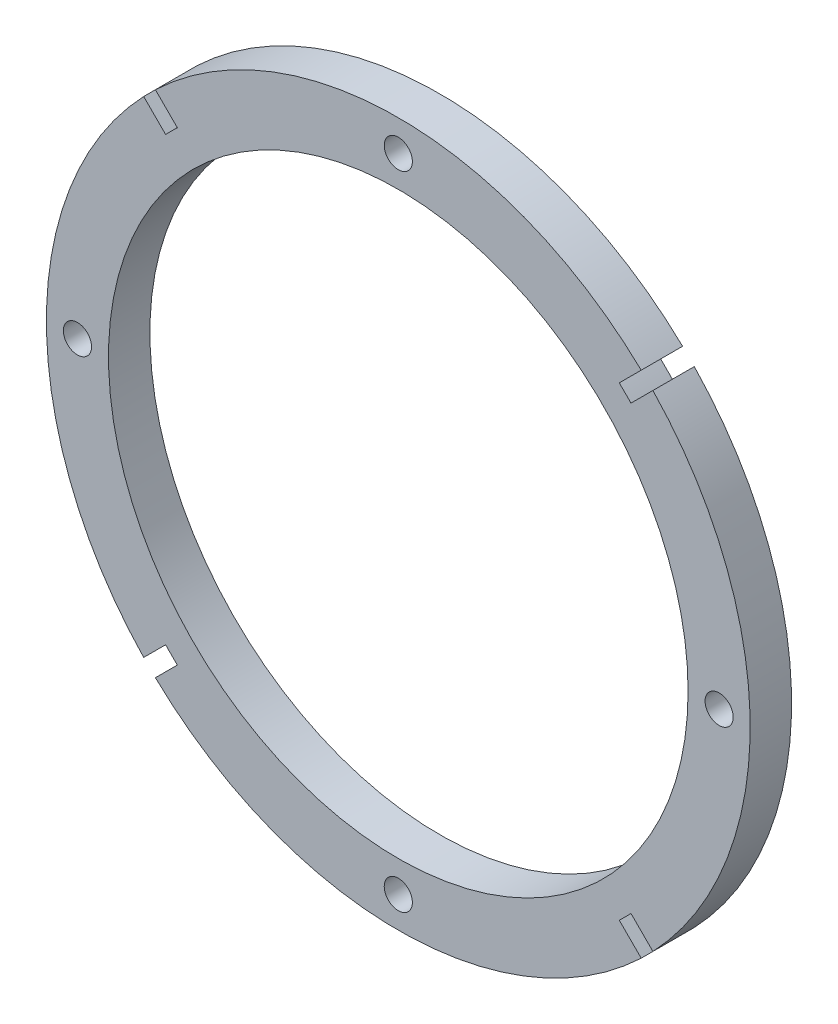
ISO-10303-21;
HEADER;
FILE_DESCRIPTION(('STEP AP214'),'2;1');
FILE_NAME('part.step','',(''),(''),'','','');
FILE_SCHEMA(('AUTOMOTIVE_DESIGN { 1 0 10303 214 1 1 1 1 }'));
ENDSEC;
DATA;
#1=APPLICATION_CONTEXT('core data for automotive mechanical design processes');
#2=APPLICATION_PROTOCOL_DEFINITION('international standard','automotive_design',2000,#1);
#3=PRODUCT_CONTEXT('',#1,'mechanical');
#4=PRODUCT('Part','Part','',(#3));
#5=PRODUCT_RELATED_PRODUCT_CATEGORY('part','',(#4));
#6=PRODUCT_DEFINITION_FORMATION('','',#4);
#7=PRODUCT_DEFINITION_CONTEXT('part definition',#1,'design');
#8=PRODUCT_DEFINITION('design','',#6,#7);
#9=PRODUCT_DEFINITION_SHAPE('','',#8);
#10=(LENGTH_UNIT() NAMED_UNIT(*) SI_UNIT(.MILLI.,.METRE.));
#11=(NAMED_UNIT(*) PLANE_ANGLE_UNIT() SI_UNIT($,.RADIAN.));
#12=(NAMED_UNIT(*) SI_UNIT($,.STERADIAN.) SOLID_ANGLE_UNIT());
#13=UNCERTAINTY_MEASURE_WITH_UNIT(LENGTH_MEASURE(1.E-05),#10,'distance_accuracy_value','');
#14=(GEOMETRIC_REPRESENTATION_CONTEXT(3) GLOBAL_UNCERTAINTY_ASSIGNED_CONTEXT((#13)) GLOBAL_UNIT_ASSIGNED_CONTEXT((#10,
#11,#12)) REPRESENTATION_CONTEXT('',''));
#15=CARTESIAN_POINT('',(0.,0.,0.));
#16=DIRECTION('',(0.,0.,1.));
#17=DIRECTION('',(1.,0.,0.));
#18=AXIS2_PLACEMENT_3D('',#15,#16,#17);
#19=CARTESIAN_POINT('',(0.,0.,10.));
#20=DIRECTION('',(0.,0.,-1.));
#21=DIRECTION('',(-1.,0.,0.));
#22=AXIS2_PLACEMENT_3D('',#19,#20,#21);
#23=CYLINDRICAL_SURFACE('',#22,85.);
#24=CARTESIAN_POINT('',(0.,0.,0.));
#25=DIRECTION('',(0.,0.,1.));
#26=DIRECTION('',(1.,0.,0.));
#27=AXIS2_PLACEMENT_3D('',#24,#25,#26);
#28=CIRCLE('',#27,85.);
#29=CARTESIAN_POINT('',(-61.5016498531649,58.6732227284193,0.));
#30=VERTEX_POINT('',#29);
#31=CARTESIAN_POINT('',(-61.5016498531653,-58.6732227284189,0.));
#32=VERTEX_POINT('',#31);
#33=EDGE_CURVE('E55',#30,#32,#28,.T.);
#34=ORIENTED_EDGE('',*,*,#33,.T.);
#35=DIRECTION('',(0.,0.,1.));
#36=VECTOR('',#35,1.);
#37=CARTESIAN_POINT('',(-61.5016498531653,-58.6732227284189,0.));
#38=LINE('',#37,#36);
#39=CARTESIAN_POINT('',(-61.5016498531653,-58.6732227284189,10.));
#40=VERTEX_POINT('',#39);
#41=EDGE_CURVE('E205',#32,#40,#38,.T.);
#42=ORIENTED_EDGE('',*,*,#41,.T.);
#43=CARTESIAN_POINT('',(0.,0.,10.));
#44=DIRECTION('',(0.,0.,1.));
#45=DIRECTION('',(1.,0.,0.));
#46=AXIS2_PLACEMENT_3D('',#43,#44,#45);
#47=CIRCLE('',#46,85.);
#48=CARTESIAN_POINT('',(-61.5016498531649,58.6732227284194,10.));
#49=VERTEX_POINT('',#48);
#50=EDGE_CURVE('E12',#49,#40,#47,.T.);
#51=ORIENTED_EDGE('',*,*,#50,.F.);
#52=DIRECTION('',(0.,0.,1.));
#53=VECTOR('',#52,1.);
#54=CARTESIAN_POINT('',(-61.5016498531649,58.6732227284194,0.));
#55=LINE('',#54,#53);
#56=EDGE_CURVE('E277',#30,#49,#55,.T.);
#57=ORIENTED_EDGE('',*,*,#56,.F.);
#58=EDGE_LOOP('',(#34,#42,#51,#57));
#59=FACE_BOUND('',#58,.T.);
#60=ADVANCED_FACE('F51',(#59),#23,.T.);
#61=CARTESIAN_POINT('',(-58.6732227284191,-61.5016498531651,10.));
#62=VERTEX_POINT('',#61);
#63=CARTESIAN_POINT('',(58.6732227284187,-61.5016498531655,10.));
#64=VERTEX_POINT('',#63);
#65=EDGE_CURVE('E60',#62,#64,#47,.T.);
#66=ORIENTED_EDGE('',*,*,#65,.F.);
#67=DIRECTION('',(0.,0.,1.));
#68=VECTOR('',#67,1.);
#69=CARTESIAN_POINT('',(-58.6732227284191,-61.5016498531651,0.));
#70=LINE('',#69,#68);
#71=CARTESIAN_POINT('',(-58.6732227284191,-61.5016498531651,0.));
#72=VERTEX_POINT('',#71);
#73=EDGE_CURVE('E177',#72,#62,#70,.T.);
#74=ORIENTED_EDGE('',*,*,#73,.F.);
#75=CARTESIAN_POINT('',(58.6732227284187,-61.5016498531655,0.));
#76=VERTEX_POINT('',#75);
#77=EDGE_CURVE('E192',#72,#76,#28,.T.);
#78=ORIENTED_EDGE('',*,*,#77,.T.);
#79=DIRECTION('',(0.,0.,1.));
#80=VECTOR('',#79,1.);
#81=CARTESIAN_POINT('',(58.6732227284187,-61.5016498531655,0.));
#82=LINE('',#81,#80);
#83=EDGE_CURVE('E215',#76,#64,#82,.T.);
#84=ORIENTED_EDGE('',*,*,#83,.T.);
#85=EDGE_LOOP('',(#66,#74,#78,#84));
#86=FACE_BOUND('',#85,.T.);
#87=ADVANCED_FACE('F331',(#86),#23,.T.);
#88=CARTESIAN_POINT('',(61.5016498531649,-58.6732227284194,10.));
#89=VERTEX_POINT('',#88);
#90=CARTESIAN_POINT('',(61.5016498531649,58.6732227284194,10.));
#91=VERTEX_POINT('',#90);
#92=EDGE_CURVE('E343',#89,#91,#47,.T.);
#93=ORIENTED_EDGE('',*,*,#92,.F.);
#94=DIRECTION('',(0.,0.,1.));
#95=VECTOR('',#94,1.);
#96=CARTESIAN_POINT('',(61.5016498531649,-58.6732227284194,0.));
#97=LINE('',#96,#95);
#98=CARTESIAN_POINT('',(61.5016498531649,-58.6732227284193,0.));
#99=VERTEX_POINT('',#98);
#100=EDGE_CURVE('E223',#99,#89,#97,.T.);
#101=ORIENTED_EDGE('',*,*,#100,.F.);
#102=CARTESIAN_POINT('',(61.5016498531649,58.6732227284194,0.));
#103=VERTEX_POINT('',#102);
#104=EDGE_CURVE('E345',#99,#103,#28,.T.);
#105=ORIENTED_EDGE('',*,*,#104,.T.);
#106=DIRECTION('',(0.,0.,1.));
#107=VECTOR('',#106,1.);
#108=CARTESIAN_POINT('',(61.5016498531649,58.6732227284194,0.));
#109=LINE('',#108,#107);
#110=EDGE_CURVE('E244',#103,#91,#109,.T.);
#111=ORIENTED_EDGE('',*,*,#110,.T.);
#112=EDGE_LOOP('',(#93,#101,#105,#111));
#113=FACE_BOUND('',#112,.T.);
#114=ADVANCED_FACE('F328',(#113),#23,.T.);
#115=CARTESIAN_POINT('',(0.,0.,10.));
#116=DIRECTION('',(0.,0.,1.));
#117=DIRECTION('',(1.,0.,0.));
#118=AXIS2_PLACEMENT_3D('',#115,#116,#117);
#119=PLANE('',#118);
#120=CARTESIAN_POINT('',(-77.5,-2.68218579008117E-13,10.));
#121=DIRECTION('',(0.,0.,1.));
#122=DIRECTION('',(0.,1.,0.));
#123=AXIS2_PLACEMENT_3D('',#120,#121,#122);
#124=CIRCLE('',#123,3.4);
#125=CARTESIAN_POINT('',(-77.5,3.39999999999973,10.));
#126=VERTEX_POINT('',#125);
#127=EDGE_CURVE('E198',#126,#126,#124,.T.);
#128=ORIENTED_EDGE('',*,*,#127,.F.);
#129=EDGE_LOOP('',(#128));
#130=FACE_BOUND('',#129,.T.);
#131=DIRECTION('',(-0.707106781186548,-0.707106781186547,0.));
#132=VECTOR('',#131,1.);
#133=CARTESIAN_POINT('',(-56.19673814823,-53.3683110234836,10.));
#134=LINE('',#133,#132);
#135=CARTESIAN_POINT('',(-56.19673814823,-53.3683110234836,10.));
#136=VERTEX_POINT('',#135);
#137=EDGE_CURVE('E193',#136,#40,#134,.T.);
#138=ORIENTED_EDGE('',*,*,#137,.F.);
#139=CARTESIAN_POINT('',(0.,0.,10.));
#140=DIRECTION('',(0.,0.,-1.));
#141=DIRECTION('',(0.,1.,0.));
#142=AXIS2_PLACEMENT_3D('',#139,#140,#141);
#143=CIRCLE('',#142,77.5);
#144=CARTESIAN_POINT('',(-53.3683110234838,-56.1967381482298,10.));
#145=VERTEX_POINT('',#144);
#146=EDGE_CURVE('E195',#145,#136,#143,.T.);
#147=ORIENTED_EDGE('',*,*,#146,.F.);
#148=DIRECTION('',(0.70710678118655,0.707106781186545,0.));
#149=VECTOR('',#148,1.);
#150=CARTESIAN_POINT('',(-53.3683110234838,-56.1967381482298,10.));
#151=LINE('',#150,#149);
#152=EDGE_CURVE('E172',#62,#145,#151,.T.);
#153=ORIENTED_EDGE('',*,*,#152,.F.);
#154=ORIENTED_EDGE('',*,*,#65,.T.);
#155=DIRECTION('',(0.707106781186544,-0.707106781186551,0.));
#156=VECTOR('',#155,1.);
#157=CARTESIAN_POINT('',(53.3683110234834,-56.1967381482302,10.));
#158=LINE('',#157,#156);
#159=CARTESIAN_POINT('',(53.3683110234834,-56.1967381482302,10.));
#160=VERTEX_POINT('',#159);
#161=EDGE_CURVE('E218',#160,#64,#158,.T.);
#162=ORIENTED_EDGE('',*,*,#161,.F.);
#163=CARTESIAN_POINT('',(0.,0.,10.));
#164=DIRECTION('',(0.,0.,-1.));
#165=DIRECTION('',(-1.,0.,0.));
#166=AXIS2_PLACEMENT_3D('',#163,#164,#165);
#167=CIRCLE('',#166,77.5);
#168=CARTESIAN_POINT('',(56.1967381482296,-53.368311023484,10.));
#169=VERTEX_POINT('',#168);
#170=EDGE_CURVE('E227',#169,#160,#167,.T.);
#171=ORIENTED_EDGE('',*,*,#170,.F.);
#172=DIRECTION('',(-0.707106781186543,0.707106781186552,0.));
#173=VECTOR('',#172,1.);
#174=CARTESIAN_POINT('',(56.1967381482296,-53.368311023484,10.));
#175=LINE('',#174,#173);
#176=EDGE_CURVE('E224',#89,#169,#175,.T.);
#177=ORIENTED_EDGE('',*,*,#176,.F.);
#178=ORIENTED_EDGE('',*,*,#92,.T.);
#179=DIRECTION('',(0.707106781186543,0.707106781186552,0.));
#180=VECTOR('',#179,1.);
#181=CARTESIAN_POINT('',(56.1967381482296,53.368311023484,10.));
#182=LINE('',#181,#180);
#183=CARTESIAN_POINT('',(56.1967381482296,53.368311023484,10.));
#184=VERTEX_POINT('',#183);
#185=EDGE_CURVE('E247',#184,#91,#182,.T.);
#186=ORIENTED_EDGE('',*,*,#185,.F.);
#187=CARTESIAN_POINT('',(0.,0.,10.));
#188=DIRECTION('',(0.,0.,-1.));
#189=DIRECTION('',(0.,-1.,0.));
#190=AXIS2_PLACEMENT_3D('',#187,#188,#189);
#191=CIRCLE('',#190,77.5);
#192=CARTESIAN_POINT('',(53.3683110234834,56.1967381482302,10.));
#193=VERTEX_POINT('',#192);
#194=EDGE_CURVE('E257',#193,#184,#191,.T.);
#195=ORIENTED_EDGE('',*,*,#194,.F.);
#196=DIRECTION('',(-0.707106781186545,-0.70710678118655,0.));
#197=VECTOR('',#196,1.);
#198=CARTESIAN_POINT('',(53.3683110234834,56.1967381482302,10.));
#199=LINE('',#198,#197);
#200=CARTESIAN_POINT('',(58.6732227284187,61.5016498531655,10.));
#201=VERTEX_POINT('',#200);
#202=EDGE_CURVE('E254',#201,#193,#199,.T.);
#203=ORIENTED_EDGE('',*,*,#202,.F.);
#204=CARTESIAN_POINT('',(-58.6732227284187,61.5016498531655,10.));
#205=VERTEX_POINT('',#204);
#206=EDGE_CURVE('E61',#201,#205,#47,.T.);
#207=ORIENTED_EDGE('',*,*,#206,.T.);
#208=DIRECTION('',(-0.707106781186544,0.707106781186551,0.));
#209=VECTOR('',#208,1.);
#210=CARTESIAN_POINT('',(-53.3683110234834,56.1967381482302,10.));
#211=LINE('',#210,#209);
#212=CARTESIAN_POINT('',(-53.3683110234834,56.1967381482302,10.));
#213=VERTEX_POINT('',#212);
#214=EDGE_CURVE('E288',#213,#205,#211,.T.);
#215=ORIENTED_EDGE('',*,*,#214,.F.);
#216=CARTESIAN_POINT('',(0.,0.,10.));
#217=DIRECTION('',(0.,0.,-1.));
#218=DIRECTION('',(1.,0.,0.));
#219=AXIS2_PLACEMENT_3D('',#216,#217,#218);
#220=CIRCLE('',#219,77.5);
#221=CARTESIAN_POINT('',(-56.1967381482296,53.368311023484,10.));
#222=VERTEX_POINT('',#221);
#223=EDGE_CURVE('E291',#222,#213,#220,.T.);
#224=ORIENTED_EDGE('',*,*,#223,.F.);
#225=DIRECTION('',(0.707106781186543,-0.707106781186552,0.));
#226=VECTOR('',#225,1.);
#227=CARTESIAN_POINT('',(-56.1967381482296,53.368311023484,10.));
#228=LINE('',#227,#226);
#229=EDGE_CURVE('E276',#49,#222,#228,.T.);
#230=ORIENTED_EDGE('',*,*,#229,.F.);
#231=ORIENTED_EDGE('',*,*,#50,.T.);
#232=EDGE_LOOP('',(#138,#147,#153,#154,#162,#171,#177,#178,#186,#195,#203,#207,#215,#224,#230,#231));
#233=FACE_BOUND('',#232,.T.);
#234=CARTESIAN_POINT('',(0.,-77.5,10.));
#235=DIRECTION('',(0.,0.,1.));
#236=DIRECTION('',(-1.,0.,0.));
#237=AXIS2_PLACEMENT_3D('',#234,#235,#236);
#238=CIRCLE('',#237,3.4);
#239=CARTESIAN_POINT('',(-3.4,-77.5,10.));
#240=VERTEX_POINT('',#239);
#241=EDGE_CURVE('E212',#240,#240,#238,.T.);
#242=ORIENTED_EDGE('',*,*,#241,.F.);
#243=EDGE_LOOP('',(#242));
#244=FACE_BOUND('',#243,.T.);
#245=CARTESIAN_POINT('',(77.5,8.09398186528803E-13,10.));
#246=DIRECTION('',(0.,0.,1.));
#247=DIRECTION('',(0.,-1.,0.));
#248=AXIS2_PLACEMENT_3D('',#245,#246,#247);
#249=CIRCLE('',#248,3.4);
#250=CARTESIAN_POINT('',(77.5,-3.39999999999919,10.));
#251=VERTEX_POINT('',#250);
#252=EDGE_CURVE('E241',#251,#251,#249,.T.);
#253=ORIENTED_EDGE('',*,*,#252,.F.);
#254=EDGE_LOOP('',(#253));
#255=FACE_BOUND('',#254,.T.);
#256=CARTESIAN_POINT('',(0.,77.5,10.));
#257=DIRECTION('',(0.,0.,1.));
#258=DIRECTION('',(1.,0.,0.));
#259=AXIS2_PLACEMENT_3D('',#256,#257,#258);
#260=CIRCLE('',#259,3.4);
#261=CARTESIAN_POINT('',(3.4,77.5,10.));
#262=VERTEX_POINT('',#261);
#263=EDGE_CURVE('E273',#262,#262,#260,.T.);
#264=ORIENTED_EDGE('',*,*,#263,.F.);
#265=EDGE_LOOP('',(#264));
#266=FACE_BOUND('',#265,.T.);
#267=CARTESIAN_POINT('',(0.,0.,10.));
#268=DIRECTION('',(0.,0.,1.));
#269=DIRECTION('',(1.,0.,0.));
#270=AXIS2_PLACEMENT_3D('',#267,#268,#269);
#271=CIRCLE('',#270,70.);
#272=CARTESIAN_POINT('',(70.,0.,10.));
#273=VERTEX_POINT('',#272);
#274=EDGE_CURVE('E304',#273,#273,#271,.T.);
#275=ORIENTED_EDGE('',*,*,#274,.F.);
#276=EDGE_LOOP('',(#275));
#277=FACE_BOUND('',#276,.T.);
#278=ADVANCED_FACE('F362',(#130,#233,#244,#255,#266,#277),#119,.T.);
#279=CARTESIAN_POINT('',(0.,0.,0.));
#280=DIRECTION('',(0.,0.,1.));
#281=DIRECTION('',(1.,0.,0.));
#282=AXIS2_PLACEMENT_3D('',#279,#280,#281);
#283=PLANE('',#282);
#284=CARTESIAN_POINT('',(-77.5,-2.68218579008117E-13,0.));
#285=DIRECTION('',(0.,0.,1.));
#286=DIRECTION('',(0.,1.,0.));
#287=AXIS2_PLACEMENT_3D('',#284,#285,#286);
#288=CIRCLE('',#287,3.4);
#289=CARTESIAN_POINT('',(-77.5,3.39999999999973,0.));
#290=VERTEX_POINT('',#289);
#291=EDGE_CURVE('E287',#290,#290,#288,.T.);
#292=ORIENTED_EDGE('',*,*,#291,.T.);
#293=EDGE_LOOP('',(#292));
#294=FACE_BOUND('',#293,.T.);
#295=CARTESIAN_POINT('',(0.,-77.5,0.));
#296=DIRECTION('',(0.,0.,1.));
#297=DIRECTION('',(-1.,0.,0.));
#298=AXIS2_PLACEMENT_3D('',#295,#296,#297);
#299=CIRCLE('',#298,3.4);
#300=CARTESIAN_POINT('',(-3.4,-77.5,0.));
#301=VERTEX_POINT('',#300);
#302=EDGE_CURVE('E203',#301,#301,#299,.T.);
#303=ORIENTED_EDGE('',*,*,#302,.T.);
#304=EDGE_LOOP('',(#303));
#305=FACE_BOUND('',#304,.T.);
#306=CARTESIAN_POINT('',(77.5,8.09398186528803E-13,0.));
#307=DIRECTION('',(0.,0.,1.));
#308=DIRECTION('',(0.,-1.,0.));
#309=AXIS2_PLACEMENT_3D('',#306,#307,#308);
#310=CIRCLE('',#309,3.4);
#311=CARTESIAN_POINT('',(77.5,-3.39999999999919,0.));
#312=VERTEX_POINT('',#311);
#313=EDGE_CURVE('E228',#312,#312,#310,.T.);
#314=ORIENTED_EDGE('',*,*,#313,.T.);
#315=EDGE_LOOP('',(#314));
#316=FACE_BOUND('',#315,.T.);
#317=CARTESIAN_POINT('',(0.,77.5,0.));
#318=DIRECTION('',(0.,0.,1.));
#319=DIRECTION('',(1.,0.,0.));
#320=AXIS2_PLACEMENT_3D('',#317,#318,#319);
#321=CIRCLE('',#320,3.4);
#322=CARTESIAN_POINT('',(3.4,77.5,0.));
#323=VERTEX_POINT('',#322);
#324=EDGE_CURVE('E268',#323,#323,#321,.T.);
#325=ORIENTED_EDGE('',*,*,#324,.T.);
#326=EDGE_LOOP('',(#325));
#327=FACE_BOUND('',#326,.T.);
#328=CARTESIAN_POINT('',(0.,0.,0.));
#329=DIRECTION('',(0.,0.,-1.));
#330=DIRECTION('',(0.,1.,0.));
#331=AXIS2_PLACEMENT_3D('',#328,#329,#330);
#332=CIRCLE('',#331,77.5);
#333=CARTESIAN_POINT('',(-53.3683110234838,-56.1967381482298,0.));
#334=VERTEX_POINT('',#333);
#335=CARTESIAN_POINT('',(-56.19673814823,-53.3683110234836,0.));
#336=VERTEX_POINT('',#335);
#337=EDGE_CURVE('E180',#334,#336,#332,.T.);
#338=ORIENTED_EDGE('',*,*,#337,.T.);
#339=DIRECTION('',(-0.707106781186548,-0.707106781186547,0.));
#340=VECTOR('',#339,1.);
#341=CARTESIAN_POINT('',(-56.19673814823,-53.3683110234836,0.));
#342=LINE('',#341,#340);
#343=EDGE_CURVE('E185',#336,#32,#342,.T.);
#344=ORIENTED_EDGE('',*,*,#343,.T.);
#345=ORIENTED_EDGE('',*,*,#33,.F.);
#346=DIRECTION('',(0.707106781186543,-0.707106781186552,0.));
#347=VECTOR('',#346,1.);
#348=CARTESIAN_POINT('',(-56.1967381482296,53.368311023484,0.));
#349=LINE('',#348,#347);
#350=CARTESIAN_POINT('',(-56.1967381482296,53.368311023484,0.));
#351=VERTEX_POINT('',#350);
#352=EDGE_CURVE('E292',#30,#351,#349,.T.);
#353=ORIENTED_EDGE('',*,*,#352,.T.);
#354=CARTESIAN_POINT('',(0.,0.,0.));
#355=DIRECTION('',(0.,0.,-1.));
#356=DIRECTION('',(1.,0.,0.));
#357=AXIS2_PLACEMENT_3D('',#354,#355,#356);
#358=CIRCLE('',#357,77.5);
#359=CARTESIAN_POINT('',(-53.3683110234834,56.1967381482302,0.));
#360=VERTEX_POINT('',#359);
#361=EDGE_CURVE('E299',#351,#360,#358,.T.);
#362=ORIENTED_EDGE('',*,*,#361,.T.);
#363=DIRECTION('',(-0.707106781186544,0.707106781186551,0.));
#364=VECTOR('',#363,1.);
#365=CARTESIAN_POINT('',(-53.3683110234834,56.1967381482302,0.));
#366=LINE('',#365,#364);
#367=CARTESIAN_POINT('',(-58.6732227284187,61.5016498531655,0.));
#368=VERTEX_POINT('',#367);
#369=EDGE_CURVE('E279',#360,#368,#366,.T.);
#370=ORIENTED_EDGE('',*,*,#369,.T.);
#371=CARTESIAN_POINT('',(58.6732227284187,61.5016498531655,0.));
#372=VERTEX_POINT('',#371);
#373=EDGE_CURVE('E308',#372,#368,#28,.T.);
#374=ORIENTED_EDGE('',*,*,#373,.F.);
#375=DIRECTION('',(-0.707106781186545,-0.70710678118655,0.));
#376=VECTOR('',#375,1.);
#377=CARTESIAN_POINT('',(53.3683110234834,56.1967381482302,0.));
#378=LINE('',#377,#376);
#379=CARTESIAN_POINT('',(53.3683110234834,56.1967381482302,0.));
#380=VERTEX_POINT('',#379);
#381=EDGE_CURVE('E68',#372,#380,#378,.T.);
#382=ORIENTED_EDGE('',*,*,#381,.T.);
#383=CARTESIAN_POINT('',(0.,0.,0.));
#384=DIRECTION('',(0.,0.,-1.));
#385=DIRECTION('',(0.,-1.,0.));
#386=AXIS2_PLACEMENT_3D('',#383,#384,#385);
#387=CIRCLE('',#386,77.5);
#388=CARTESIAN_POINT('',(56.1967381482296,53.368311023484,0.));
#389=VERTEX_POINT('',#388);
#390=EDGE_CURVE('E246',#380,#389,#387,.T.);
#391=ORIENTED_EDGE('',*,*,#390,.T.);
#392=DIRECTION('',(0.707106781186543,0.707106781186552,0.));
#393=VECTOR('',#392,1.);
#394=CARTESIAN_POINT('',(56.1967381482296,53.368311023484,0.));
#395=LINE('',#394,#393);
#396=EDGE_CURVE('E250',#389,#103,#395,.T.);
#397=ORIENTED_EDGE('',*,*,#396,.T.);
#398=ORIENTED_EDGE('',*,*,#104,.F.);
#399=DIRECTION('',(-0.707106781186543,0.707106781186552,0.));
#400=VECTOR('',#399,1.);
#401=CARTESIAN_POINT('',(56.1967381482296,-53.368311023484,0.));
#402=LINE('',#401,#400);
#403=CARTESIAN_POINT('',(56.1967381482296,-53.368311023484,0.));
#404=VERTEX_POINT('',#403);
#405=EDGE_CURVE('E76',#99,#404,#402,.T.);
#406=ORIENTED_EDGE('',*,*,#405,.T.);
#407=CARTESIAN_POINT('',(0.,0.,0.));
#408=DIRECTION('',(0.,0.,-1.));
#409=DIRECTION('',(-1.,0.,0.));
#410=AXIS2_PLACEMENT_3D('',#407,#408,#409);
#411=CIRCLE('',#410,77.5);
#412=CARTESIAN_POINT('',(53.3683110234834,-56.1967381482302,0.));
#413=VERTEX_POINT('',#412);
#414=EDGE_CURVE('E217',#404,#413,#411,.T.);
#415=ORIENTED_EDGE('',*,*,#414,.T.);
#416=DIRECTION('',(0.707106781186544,-0.707106781186551,0.));
#417=VECTOR('',#416,1.);
#418=CARTESIAN_POINT('',(53.3683110234834,-56.1967381482302,0.));
#419=LINE('',#418,#417);
#420=EDGE_CURVE('E221',#413,#76,#419,.T.);
#421=ORIENTED_EDGE('',*,*,#420,.T.);
#422=ORIENTED_EDGE('',*,*,#77,.F.);
#423=DIRECTION('',(0.70710678118655,0.707106781186545,0.));
#424=VECTOR('',#423,1.);
#425=CARTESIAN_POINT('',(-53.3683110234838,-56.1967381482298,0.));
#426=LINE('',#425,#424);
#427=EDGE_CURVE('E169',#72,#334,#426,.T.);
#428=ORIENTED_EDGE('',*,*,#427,.T.);
#429=EDGE_LOOP('',(#338,#344,#345,#353,#362,#370,#374,#382,#391,#397,#398,#406,#415,#421,#422,#428));
#430=FACE_BOUND('',#429,.T.);
#431=CARTESIAN_POINT('',(0.,0.,0.));
#432=DIRECTION('',(0.,0.,1.));
#433=DIRECTION('',(1.,0.,0.));
#434=AXIS2_PLACEMENT_3D('',#431,#432,#433);
#435=CIRCLE('',#434,70.);
#436=CARTESIAN_POINT('',(70.,0.,0.));
#437=VERTEX_POINT('',#436);
#438=EDGE_CURVE('E272',#437,#437,#435,.T.);
#439=ORIENTED_EDGE('',*,*,#438,.T.);
#440=EDGE_LOOP('',(#439));
#441=FACE_BOUND('',#440,.T.);
#442=ADVANCED_FACE('F188',(#294,#305,#316,#327,#430,#441),#283,.F.);
#443=ORIENTED_EDGE('',*,*,#206,.F.);
#444=DIRECTION('',(0.,0.,1.));
#445=VECTOR('',#444,1.);
#446=CARTESIAN_POINT('',(58.6732227284187,61.5016498531655,0.));
#447=LINE('',#446,#445);
#448=EDGE_CURVE('E253',#372,#201,#447,.T.);
#449=ORIENTED_EDGE('',*,*,#448,.F.);
#450=ORIENTED_EDGE('',*,*,#373,.T.);
#451=DIRECTION('',(0.,0.,1.));
#452=VECTOR('',#451,1.);
#453=CARTESIAN_POINT('',(-58.6732227284187,61.5016498531655,0.));
#454=LINE('',#453,#452);
#455=EDGE_CURVE('E284',#368,#205,#454,.T.);
#456=ORIENTED_EDGE('',*,*,#455,.T.);
#457=EDGE_LOOP('',(#443,#449,#450,#456));
#458=FACE_BOUND('',#457,.T.);
#459=ADVANCED_FACE('F53',(#458),#23,.T.);
#460=CARTESIAN_POINT('',(0.,0.,10.));
#461=DIRECTION('',(0.,0.,-1.));
#462=DIRECTION('',(-1.,0.,0.));
#463=AXIS2_PLACEMENT_3D('',#460,#461,#462);
#464=CYLINDRICAL_SURFACE('',#463,70.);
#465=ORIENTED_EDGE('',*,*,#274,.T.);
#466=EDGE_LOOP('',(#465));
#467=FACE_BOUND('',#466,.T.);
#468=ORIENTED_EDGE('',*,*,#438,.F.);
#469=EDGE_LOOP('',(#468));
#470=FACE_BOUND('',#469,.T.);
#471=ADVANCED_FACE('F314',(#467,#470),#464,.F.);
#472=CARTESIAN_POINT('',(-53.3683110234834,56.1967381482302,0.));
#473=DIRECTION('',(0.707106781186551,0.707106781186544,0.));
#474=DIRECTION('',(-0.707106781186544,0.707106781186551,0.));
#475=AXIS2_PLACEMENT_3D('',#472,#473,#474);
#476=PLANE('',#475);
#477=ORIENTED_EDGE('',*,*,#214,.T.);
#478=ORIENTED_EDGE('',*,*,#455,.F.);
#479=ORIENTED_EDGE('',*,*,#369,.F.);
#480=DIRECTION('',(0.,0.,1.));
#481=VECTOR('',#480,1.);
#482=CARTESIAN_POINT('',(-53.3683110234834,56.1967381482302,0.));
#483=LINE('',#482,#481);
#484=EDGE_CURVE('E282',#360,#213,#483,.T.);
#485=ORIENTED_EDGE('',*,*,#484,.T.);
#486=EDGE_LOOP('',(#477,#478,#479,#485));
#487=FACE_BOUND('',#486,.T.);
#488=ADVANCED_FACE('F316',(#487),#476,.F.);
#489=CARTESIAN_POINT('',(0.,0.,0.));
#490=DIRECTION('',(0.,0.,1.));
#491=DIRECTION('',(1.,0.,0.));
#492=AXIS2_PLACEMENT_3D('',#489,#490,#491);
#493=CYLINDRICAL_SURFACE('',#492,77.5);
#494=ORIENTED_EDGE('',*,*,#223,.T.);
#495=ORIENTED_EDGE('',*,*,#484,.F.);
#496=ORIENTED_EDGE('',*,*,#361,.F.);
#497=DIRECTION('',(0.,0.,1.));
#498=VECTOR('',#497,1.);
#499=CARTESIAN_POINT('',(-56.1967381482296,53.368311023484,0.));
#500=LINE('',#499,#498);
#501=EDGE_CURVE('E280',#351,#222,#500,.T.);
#502=ORIENTED_EDGE('',*,*,#501,.T.);
#503=EDGE_LOOP('',(#494,#495,#496,#502));
#504=FACE_BOUND('',#503,.T.);
#505=ADVANCED_FACE('F323',(#504),#493,.T.);
#506=CARTESIAN_POINT('',(-56.1967381482296,53.368311023484,0.));
#507=DIRECTION('',(-0.707106781186552,-0.707106781186543,0.));
#508=DIRECTION('',(0.707106781186543,-0.707106781186552,0.));
#509=AXIS2_PLACEMENT_3D('',#506,#507,#508);
#510=PLANE('',#509);
#511=ORIENTED_EDGE('',*,*,#229,.T.);
#512=ORIENTED_EDGE('',*,*,#501,.F.);
#513=ORIENTED_EDGE('',*,*,#352,.F.);
#514=ORIENTED_EDGE('',*,*,#56,.T.);
#515=EDGE_LOOP('',(#511,#512,#513,#514));
#516=FACE_BOUND('',#515,.T.);
#517=ADVANCED_FACE('F405',(#516),#510,.F.);
#518=CARTESIAN_POINT('',(0.,77.5,0.));
#519=DIRECTION('',(0.,0.,1.));
#520=DIRECTION('',(1.,0.,0.));
#521=AXIS2_PLACEMENT_3D('',#518,#519,#520);
#522=CYLINDRICAL_SURFACE('',#521,3.4);
#523=ORIENTED_EDGE('',*,*,#324,.F.);
#524=EDGE_LOOP('',(#523));
#525=FACE_BOUND('',#524,.T.);
#526=ORIENTED_EDGE('',*,*,#263,.T.);
#527=EDGE_LOOP('',(#526));
#528=FACE_BOUND('',#527,.T.);
#529=ADVANCED_FACE('F397',(#525,#528),#522,.F.);
#530=CARTESIAN_POINT('',(56.1967381482296,53.368311023484,0.));
#531=DIRECTION('',(0.707106781186552,-0.707106781186543,0.));
#532=DIRECTION('',(0.707106781186543,0.707106781186552,0.));
#533=AXIS2_PLACEMENT_3D('',#530,#531,#532);
#534=PLANE('',#533);
#535=ORIENTED_EDGE('',*,*,#185,.T.);
#536=ORIENTED_EDGE('',*,*,#110,.F.);
#537=ORIENTED_EDGE('',*,*,#396,.F.);
#538=DIRECTION('',(0.,0.,1.));
#539=VECTOR('',#538,1.);
#540=CARTESIAN_POINT('',(56.1967381482296,53.368311023484,0.));
#541=LINE('',#540,#539);
#542=EDGE_CURVE('E263',#389,#184,#541,.T.);
#543=ORIENTED_EDGE('',*,*,#542,.T.);
#544=EDGE_LOOP('',(#535,#536,#537,#543));
#545=FACE_BOUND('',#544,.T.);
#546=ADVANCED_FACE('F357',(#545),#534,.F.);
#547=CARTESIAN_POINT('',(0.,0.,0.));
#548=DIRECTION('',(0.,0.,1.));
#549=DIRECTION('',(1.,0.,0.));
#550=AXIS2_PLACEMENT_3D('',#547,#548,#549);
#551=CYLINDRICAL_SURFACE('',#550,77.5);
#552=ORIENTED_EDGE('',*,*,#194,.T.);
#553=ORIENTED_EDGE('',*,*,#542,.F.);
#554=ORIENTED_EDGE('',*,*,#390,.F.);
#555=DIRECTION('',(0.,0.,1.));
#556=VECTOR('',#555,1.);
#557=CARTESIAN_POINT('',(53.3683110234834,56.1967381482302,0.));
#558=LINE('',#557,#556);
#559=EDGE_CURVE('E265',#380,#193,#558,.T.);
#560=ORIENTED_EDGE('',*,*,#559,.T.);
#561=EDGE_LOOP('',(#552,#553,#554,#560));
#562=FACE_BOUND('',#561,.T.);
#563=ADVANCED_FACE('F396',(#562),#551,.T.);
#564=CARTESIAN_POINT('',(53.3683110234834,56.1967381482302,0.));
#565=DIRECTION('',(-0.70710678118655,0.707106781186545,0.));
#566=DIRECTION('',(-0.707106781186545,-0.70710678118655,0.));
#567=AXIS2_PLACEMENT_3D('',#564,#565,#566);
#568=PLANE('',#567);
#569=ORIENTED_EDGE('',*,*,#202,.T.);
#570=ORIENTED_EDGE('',*,*,#559,.F.);
#571=ORIENTED_EDGE('',*,*,#381,.F.);
#572=ORIENTED_EDGE('',*,*,#448,.T.);
#573=EDGE_LOOP('',(#569,#570,#571,#572));
#574=FACE_BOUND('',#573,.T.);
#575=ADVANCED_FACE('F400',(#574),#568,.F.);
#576=CARTESIAN_POINT('',(53.3683110234834,-56.1967381482302,0.));
#577=DIRECTION('',(-0.707106781186551,-0.707106781186544,0.));
#578=DIRECTION('',(0.707106781186544,-0.707106781186551,0.));
#579=AXIS2_PLACEMENT_3D('',#576,#577,#578);
#580=PLANE('',#579);
#581=ORIENTED_EDGE('',*,*,#161,.T.);
#582=ORIENTED_EDGE('',*,*,#83,.F.);
#583=ORIENTED_EDGE('',*,*,#420,.F.);
#584=DIRECTION('',(0.,0.,1.));
#585=VECTOR('',#584,1.);
#586=CARTESIAN_POINT('',(53.3683110234834,-56.1967381482302,0.));
#587=LINE('',#586,#585);
#588=EDGE_CURVE('E234',#413,#160,#587,.T.);
#589=ORIENTED_EDGE('',*,*,#588,.T.);
#590=EDGE_LOOP('',(#581,#582,#583,#589));
#591=FACE_BOUND('',#590,.T.);
#592=ADVANCED_FACE('F372',(#591),#580,.F.);
#593=CARTESIAN_POINT('',(0.,0.,0.));
#594=DIRECTION('',(0.,0.,1.));
#595=DIRECTION('',(1.,0.,0.));
#596=AXIS2_PLACEMENT_3D('',#593,#594,#595);
#597=CYLINDRICAL_SURFACE('',#596,77.5);
#598=ORIENTED_EDGE('',*,*,#170,.T.);
#599=ORIENTED_EDGE('',*,*,#588,.F.);
#600=ORIENTED_EDGE('',*,*,#414,.F.);
#601=DIRECTION('',(0.,0.,1.));
#602=VECTOR('',#601,1.);
#603=CARTESIAN_POINT('',(56.1967381482296,-53.368311023484,0.));
#604=LINE('',#603,#602);
#605=EDGE_CURVE('E236',#404,#169,#604,.T.);
#606=ORIENTED_EDGE('',*,*,#605,.T.);
#607=EDGE_LOOP('',(#598,#599,#600,#606));
#608=FACE_BOUND('',#607,.T.);
#609=ADVANCED_FACE('F375',(#608),#597,.T.);
#610=CARTESIAN_POINT('',(56.1967381482296,-53.368311023484,0.));
#611=DIRECTION('',(0.707106781186552,0.707106781186543,0.));
#612=DIRECTION('',(-0.707106781186543,0.707106781186552,0.));
#613=AXIS2_PLACEMENT_3D('',#610,#611,#612);
#614=PLANE('',#613);
#615=ORIENTED_EDGE('',*,*,#176,.T.);
#616=ORIENTED_EDGE('',*,*,#605,.F.);
#617=ORIENTED_EDGE('',*,*,#405,.F.);
#618=ORIENTED_EDGE('',*,*,#100,.T.);
#619=EDGE_LOOP('',(#615,#616,#617,#618));
#620=FACE_BOUND('',#619,.T.);
#621=ADVANCED_FACE('F376',(#620),#614,.F.);
#622=CARTESIAN_POINT('',(-56.19673814823,-53.3683110234836,0.));
#623=DIRECTION('',(-0.707106781186547,0.707106781186548,0.));
#624=DIRECTION('',(-0.707106781186548,-0.707106781186547,0.));
#625=AXIS2_PLACEMENT_3D('',#622,#623,#624);
#626=PLANE('',#625);
#627=ORIENTED_EDGE('',*,*,#137,.T.);
#628=ORIENTED_EDGE('',*,*,#41,.F.);
#629=ORIENTED_EDGE('',*,*,#343,.F.);
#630=DIRECTION('',(0.,0.,1.));
#631=VECTOR('',#630,1.);
#632=CARTESIAN_POINT('',(-56.19673814823,-53.3683110234836,0.));
#633=LINE('',#632,#631);
#634=EDGE_CURVE('E176',#336,#136,#633,.T.);
#635=ORIENTED_EDGE('',*,*,#634,.T.);
#636=EDGE_LOOP('',(#627,#628,#629,#635));
#637=FACE_BOUND('',#636,.T.);
#638=ADVANCED_FACE('F378',(#637),#626,.F.);
#639=CARTESIAN_POINT('',(0.,0.,0.));
#640=DIRECTION('',(0.,0.,1.));
#641=DIRECTION('',(1.,0.,0.));
#642=AXIS2_PLACEMENT_3D('',#639,#640,#641);
#643=CYLINDRICAL_SURFACE('',#642,77.5);
#644=ORIENTED_EDGE('',*,*,#146,.T.);
#645=ORIENTED_EDGE('',*,*,#634,.F.);
#646=ORIENTED_EDGE('',*,*,#337,.F.);
#647=DIRECTION('',(0.,0.,1.));
#648=VECTOR('',#647,1.);
#649=CARTESIAN_POINT('',(-53.3683110234838,-56.1967381482298,0.));
#650=LINE('',#649,#648);
#651=EDGE_CURVE('E165',#334,#145,#650,.T.);
#652=ORIENTED_EDGE('',*,*,#651,.T.);
#653=EDGE_LOOP('',(#644,#645,#646,#652));
#654=FACE_BOUND('',#653,.T.);
#655=ADVANCED_FACE('F181',(#654),#643,.T.);
#656=CARTESIAN_POINT('',(-53.3683110234838,-56.1967381482298,0.));
#657=DIRECTION('',(0.707106781186545,-0.70710678118655,0.));
#658=DIRECTION('',(0.70710678118655,0.707106781186545,0.));
#659=AXIS2_PLACEMENT_3D('',#656,#657,#658);
#660=PLANE('',#659);
#661=ORIENTED_EDGE('',*,*,#152,.T.);
#662=ORIENTED_EDGE('',*,*,#651,.F.);
#663=ORIENTED_EDGE('',*,*,#427,.F.);
#664=ORIENTED_EDGE('',*,*,#73,.T.);
#665=EDGE_LOOP('',(#661,#662,#663,#664));
#666=FACE_BOUND('',#665,.T.);
#667=ADVANCED_FACE('F167',(#666),#660,.F.);
#668=CARTESIAN_POINT('',(77.5,8.09398186528803E-13,0.));
#669=DIRECTION('',(0.,0.,1.));
#670=DIRECTION('',(1.,0.,0.));
#671=AXIS2_PLACEMENT_3D('',#668,#669,#670);
#672=CYLINDRICAL_SURFACE('',#671,3.4);
#673=ORIENTED_EDGE('',*,*,#313,.F.);
#674=EDGE_LOOP('',(#673));
#675=FACE_BOUND('',#674,.T.);
#676=ORIENTED_EDGE('',*,*,#252,.T.);
#677=EDGE_LOOP('',(#676));
#678=FACE_BOUND('',#677,.T.);
#679=ADVANCED_FACE('F389',(#675,#678),#672,.F.);
#680=CARTESIAN_POINT('',(0.,-77.5,0.));
#681=DIRECTION('',(0.,0.,1.));
#682=DIRECTION('',(1.,0.,0.));
#683=AXIS2_PLACEMENT_3D('',#680,#681,#682);
#684=CYLINDRICAL_SURFACE('',#683,3.4);
#685=ORIENTED_EDGE('',*,*,#302,.F.);
#686=EDGE_LOOP('',(#685));
#687=FACE_BOUND('',#686,.T.);
#688=ORIENTED_EDGE('',*,*,#241,.T.);
#689=EDGE_LOOP('',(#688));
#690=FACE_BOUND('',#689,.T.);
#691=ADVANCED_FACE('F392',(#687,#690),#684,.F.);
#692=CARTESIAN_POINT('',(-77.5,-2.68218579008117E-13,0.));
#693=DIRECTION('',(0.,0.,1.));
#694=DIRECTION('',(1.,0.,0.));
#695=AXIS2_PLACEMENT_3D('',#692,#693,#694);
#696=CYLINDRICAL_SURFACE('',#695,3.4);
#697=ORIENTED_EDGE('',*,*,#291,.F.);
#698=EDGE_LOOP('',(#697));
#699=FACE_BOUND('',#698,.T.);
#700=ORIENTED_EDGE('',*,*,#127,.T.);
#701=EDGE_LOOP('',(#700));
#702=FACE_BOUND('',#701,.T.);
#703=ADVANCED_FACE('F522',(#699,#702),#696,.F.);
#704=CLOSED_SHELL('',(#60,#87,#114,#278,#442,#459,#471,#488,#505,#517,#529,#546,#563,#575,#592,
#609,#621,#638,#655,#667,#679,#691,#703));
#705=MANIFOLD_SOLID_BREP('B2',#704);
#706=ADVANCED_BREP_SHAPE_REPRESENTATION('',(#18,#705),#14);
#707=SHAPE_DEFINITION_REPRESENTATION(#9,#706);
ENDSEC;
END-ISO-10303-21;
